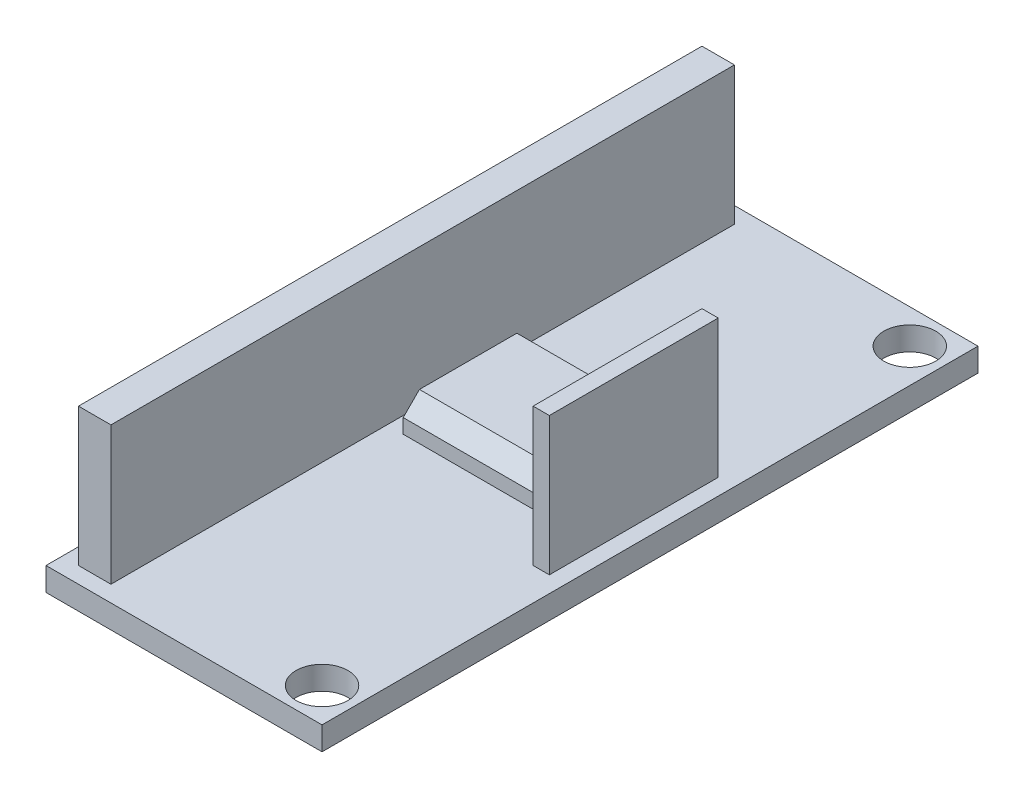
ISO-10303-21;
HEADER;
FILE_DESCRIPTION(('STEP AP214'),'2;1');
FILE_NAME('part.step','',(''),(''),'','','');
FILE_SCHEMA(('AUTOMOTIVE_DESIGN { 1 0 10303 214 1 1 1 1 }'));
ENDSEC;
DATA;
#1=APPLICATION_CONTEXT('core data for automotive mechanical design processes');
#2=APPLICATION_PROTOCOL_DEFINITION('international standard','automotive_design',2000,#1);
#3=PRODUCT_CONTEXT('',#1,'mechanical');
#4=PRODUCT('Part','Part','',(#3));
#5=PRODUCT_RELATED_PRODUCT_CATEGORY('part','',(#4));
#6=PRODUCT_DEFINITION_FORMATION('','',#4);
#7=PRODUCT_DEFINITION_CONTEXT('part definition',#1,'design');
#8=PRODUCT_DEFINITION('design','',#6,#7);
#9=PRODUCT_DEFINITION_SHAPE('','',#8);
#10=(LENGTH_UNIT() NAMED_UNIT(*) SI_UNIT(.MILLI.,.METRE.));
#11=(NAMED_UNIT(*) PLANE_ANGLE_UNIT() SI_UNIT($,.RADIAN.));
#12=(NAMED_UNIT(*) SI_UNIT($,.STERADIAN.) SOLID_ANGLE_UNIT());
#13=UNCERTAINTY_MEASURE_WITH_UNIT(LENGTH_MEASURE(1.E-05),#10,'distance_accuracy_value','');
#14=(GEOMETRIC_REPRESENTATION_CONTEXT(3) GLOBAL_UNCERTAINTY_ASSIGNED_CONTEXT((#13)) GLOBAL_UNIT_ASSIGNED_CONTEXT((#10,
#11,#12)) REPRESENTATION_CONTEXT('',''));
#15=CARTESIAN_POINT('',(0.,0.,0.));
#16=DIRECTION('',(0.,0.,1.));
#17=DIRECTION('',(1.,0.,0.));
#18=AXIS2_PLACEMENT_3D('',#15,#16,#17);
#19=CARTESIAN_POINT('',(0.,1.44,0.));
#20=DIRECTION('',(0.,-1.,0.));
#21=DIRECTION('',(0.,0.,-1.));
#22=AXIS2_PLACEMENT_3D('',#19,#20,#21);
#23=PLANE('',#22);
#24=DIRECTION('',(0.,0.,1.));
#25=VECTOR('',#24,1.);
#26=CARTESIAN_POINT('',(1.,1.44,-39.4));
#27=LINE('',#26,#25);
#28=CARTESIAN_POINT('',(1.,1.44,-39.4));
#29=VERTEX_POINT('',#28);
#30=CARTESIAN_POINT('',(1.,1.44,-1.));
#31=VERTEX_POINT('',#30);
#32=EDGE_CURVE('E181',#29,#31,#27,.T.);
#33=ORIENTED_EDGE('',*,*,#32,.F.);
#34=DIRECTION('',(-1.,0.,0.));
#35=VECTOR('',#34,1.);
#36=CARTESIAN_POINT('',(1.,1.44,-39.4));
#37=LINE('',#36,#35);
#38=CARTESIAN_POINT('',(3.,1.44,-39.4));
#39=VERTEX_POINT('',#38);
#40=EDGE_CURVE('E194',#39,#29,#37,.T.);
#41=ORIENTED_EDGE('',*,*,#40,.F.);
#42=DIRECTION('',(0.,0.,-1.));
#43=VECTOR('',#42,1.);
#44=CARTESIAN_POINT('',(3.,1.44,-39.4));
#45=LINE('',#44,#43);
#46=CARTESIAN_POINT('',(3.,1.44,-1.));
#47=VERTEX_POINT('',#46);
#48=EDGE_CURVE('E203',#47,#39,#45,.T.);
#49=ORIENTED_EDGE('',*,*,#48,.F.);
#50=DIRECTION('',(1.,0.,0.));
#51=VECTOR('',#50,1.);
#52=CARTESIAN_POINT('',(1.,1.44,-1.));
#53=LINE('',#52,#51);
#54=EDGE_CURVE('E184',#31,#47,#53,.T.);
#55=ORIENTED_EDGE('',*,*,#54,.F.);
#56=EDGE_LOOP('',(#33,#41,#49,#55));
#57=FACE_BOUND('',#56,.T.);
#58=DIRECTION('',(0.,0.,1.));
#59=VECTOR('',#58,1.);
#60=CARTESIAN_POINT('',(0.,1.44,0.));
#61=LINE('',#60,#59);
#62=CARTESIAN_POINT('',(0.,1.44,-40.4));
#63=VERTEX_POINT('',#62);
#64=CARTESIAN_POINT('',(0.,1.44,0.));
#65=VERTEX_POINT('',#64);
#66=EDGE_CURVE('E258',#63,#65,#61,.T.);
#67=ORIENTED_EDGE('',*,*,#66,.T.);
#68=DIRECTION('',(1.,0.,0.));
#69=VECTOR('',#68,1.);
#70=CARTESIAN_POINT('',(0.,1.44,0.));
#71=LINE('',#70,#69);
#72=CARTESIAN_POINT('',(17.,1.44,0.));
#73=VERTEX_POINT('',#72);
#74=EDGE_CURVE('E261',#65,#73,#71,.T.);
#75=ORIENTED_EDGE('',*,*,#74,.T.);
#76=DIRECTION('',(0.,0.,-1.));
#77=VECTOR('',#76,1.);
#78=CARTESIAN_POINT('',(17.,1.44,0.));
#79=LINE('',#78,#77);
#80=CARTESIAN_POINT('',(17.,1.44,-40.4));
#81=VERTEX_POINT('',#80);
#82=EDGE_CURVE('E264',#73,#81,#79,.T.);
#83=ORIENTED_EDGE('',*,*,#82,.T.);
#84=DIRECTION('',(-1.,0.,0.));
#85=VECTOR('',#84,1.);
#86=CARTESIAN_POINT('',(0.,1.44,-40.4));
#87=LINE('',#86,#85);
#88=EDGE_CURVE('E266',#81,#63,#87,.T.);
#89=ORIENTED_EDGE('',*,*,#88,.T.);
#90=EDGE_LOOP('',(#67,#75,#83,#89));
#91=FACE_BOUND('',#90,.T.);
#92=CARTESIAN_POINT('',(14.9,1.44,-2.1));
#93=DIRECTION('',(0.,1.,0.));
#94=DIRECTION('',(0.,0.,1.));
#95=AXIS2_PLACEMENT_3D('',#92,#93,#94);
#96=CIRCLE('',#95,1.6);
#97=CARTESIAN_POINT('',(14.9,1.44,-0.499999999999999));
#98=VERTEX_POINT('',#97);
#99=EDGE_CURVE('E245',#98,#98,#96,.T.);
#100=ORIENTED_EDGE('',*,*,#99,.F.);
#101=EDGE_LOOP('',(#100));
#102=FACE_BOUND('',#101,.T.);
#103=CARTESIAN_POINT('',(14.9,1.44,-38.3));
#104=DIRECTION('',(0.,1.,0.));
#105=DIRECTION('',(0.,0.,1.));
#106=AXIS2_PLACEMENT_3D('',#103,#104,#105);
#107=CIRCLE('',#106,1.6);
#108=CARTESIAN_POINT('',(14.9,1.44,-36.7));
#109=VERTEX_POINT('',#108);
#110=EDGE_CURVE('E250',#109,#109,#107,.T.);
#111=ORIENTED_EDGE('',*,*,#110,.F.);
#112=EDGE_LOOP('',(#111));
#113=FACE_BOUND('',#112,.T.);
#114=DIRECTION('',(0.,0.,1.));
#115=VECTOR('',#114,1.);
#116=CARTESIAN_POINT('',(4.,1.44,-26.));
#117=LINE('',#116,#115);
#118=CARTESIAN_POINT('',(4.,1.44,-26.));
#119=VERTEX_POINT('',#118);
#120=CARTESIAN_POINT('',(4.,1.44,-18.));
#121=VERTEX_POINT('',#120);
#122=EDGE_CURVE('E219',#119,#121,#117,.T.);
#123=ORIENTED_EDGE('',*,*,#122,.F.);
#124=DIRECTION('',(-1.,0.,0.));
#125=VECTOR('',#124,1.);
#126=CARTESIAN_POINT('',(4.,1.44,-26.));
#127=LINE('',#126,#125);
#128=CARTESIAN_POINT('',(14.,1.44,-26.));
#129=VERTEX_POINT('',#128);
#130=EDGE_CURVE('E224',#129,#119,#127,.T.);
#131=ORIENTED_EDGE('',*,*,#130,.F.);
#132=DIRECTION('',(0.,0.,-1.));
#133=VECTOR('',#132,1.);
#134=CARTESIAN_POINT('',(14.,1.44,-26.));
#135=LINE('',#134,#133);
#136=CARTESIAN_POINT('',(14.,1.44,-18.));
#137=VERTEX_POINT('',#136);
#138=EDGE_CURVE('E233',#137,#129,#135,.T.);
#139=ORIENTED_EDGE('',*,*,#138,.F.);
#140=DIRECTION('',(1.,0.,0.));
#141=VECTOR('',#140,1.);
#142=CARTESIAN_POINT('',(4.,1.44,-18.));
#143=LINE('',#142,#141);
#144=EDGE_CURVE('E230',#121,#137,#143,.T.);
#145=ORIENTED_EDGE('',*,*,#144,.F.);
#146=EDGE_LOOP('',(#123,#131,#139,#145));
#147=FACE_BOUND('',#146,.T.);
#148=DIRECTION('',(0.,0.,-1.));
#149=VECTOR('',#148,1.);
#150=CARTESIAN_POINT('',(16.,1.44,-25.4));
#151=LINE('',#150,#149);
#152=CARTESIAN_POINT('',(16.,1.44,-15.));
#153=VERTEX_POINT('',#152);
#154=CARTESIAN_POINT('',(16.,1.44,-25.4));
#155=VERTEX_POINT('',#154);
#156=EDGE_CURVE('E180',#153,#155,#151,.T.);
#157=ORIENTED_EDGE('',*,*,#156,.F.);
#158=DIRECTION('',(1.,0.,0.));
#159=VECTOR('',#158,1.);
#160=CARTESIAN_POINT('',(16.,1.44,-15.));
#161=LINE('',#160,#159);
#162=CARTESIAN_POINT('',(15.,1.44,-15.));
#163=VERTEX_POINT('',#162);
#164=EDGE_CURVE('E177',#163,#153,#161,.T.);
#165=ORIENTED_EDGE('',*,*,#164,.F.);
#166=DIRECTION('',(0.,0.,1.));
#167=VECTOR('',#166,1.);
#168=CARTESIAN_POINT('',(15.,1.44,-25.4));
#169=LINE('',#168,#167);
#170=CARTESIAN_POINT('',(15.,1.44,-25.4));
#171=VERTEX_POINT('',#170);
#172=EDGE_CURVE('E56',#171,#163,#169,.T.);
#173=ORIENTED_EDGE('',*,*,#172,.F.);
#174=DIRECTION('',(-1.,0.,0.));
#175=VECTOR('',#174,1.);
#176=CARTESIAN_POINT('',(16.,1.44,-25.4));
#177=LINE('',#176,#175);
#178=EDGE_CURVE('E51',#155,#171,#177,.T.);
#179=ORIENTED_EDGE('',*,*,#178,.F.);
#180=EDGE_LOOP('',(#157,#165,#173,#179));
#181=FACE_BOUND('',#180,.T.);
#182=ADVANCED_FACE('F35',(#57,#91,#102,#113,#147,#181),#23,.F.);
#183=CARTESIAN_POINT('',(0.,1.44,0.));
#184=DIRECTION('',(1.,0.,0.));
#185=DIRECTION('',(0.,0.,-1.));
#186=AXIS2_PLACEMENT_3D('',#183,#184,#185);
#187=PLANE('',#186);
#188=DIRECTION('',(0.,0.,1.));
#189=VECTOR('',#188,1.);
#190=CARTESIAN_POINT('',(0.,0.,0.));
#191=LINE('',#190,#189);
#192=CARTESIAN_POINT('',(0.,0.,-40.4));
#193=VERTEX_POINT('',#192);
#194=CARTESIAN_POINT('',(0.,0.,0.));
#195=VERTEX_POINT('',#194);
#196=EDGE_CURVE('E249',#193,#195,#191,.T.);
#197=ORIENTED_EDGE('',*,*,#196,.T.);
#198=DIRECTION('',(0.,-1.,0.));
#199=VECTOR('',#198,1.);
#200=CARTESIAN_POINT('',(0.,1.44,0.));
#201=LINE('',#200,#199);
#202=EDGE_CURVE('E284',#65,#195,#201,.T.);
#203=ORIENTED_EDGE('',*,*,#202,.F.);
#204=ORIENTED_EDGE('',*,*,#66,.F.);
#205=DIRECTION('',(0.,-1.,0.));
#206=VECTOR('',#205,1.);
#207=CARTESIAN_POINT('',(0.,1.44,-40.4));
#208=LINE('',#207,#206);
#209=EDGE_CURVE('E268',#63,#193,#208,.T.);
#210=ORIENTED_EDGE('',*,*,#209,.T.);
#211=EDGE_LOOP('',(#197,#203,#204,#210));
#212=FACE_BOUND('',#211,.T.);
#213=ADVANCED_FACE('F340',(#212),#187,.F.);
#214=CARTESIAN_POINT('',(0.,1.44,0.));
#215=DIRECTION('',(0.,0.,-1.));
#216=DIRECTION('',(-1.,0.,0.));
#217=AXIS2_PLACEMENT_3D('',#214,#215,#216);
#218=PLANE('',#217);
#219=DIRECTION('',(1.,0.,0.));
#220=VECTOR('',#219,1.);
#221=CARTESIAN_POINT('',(0.,0.,0.));
#222=LINE('',#221,#220);
#223=CARTESIAN_POINT('',(17.,0.,0.));
#224=VERTEX_POINT('',#223);
#225=EDGE_CURVE('E271',#195,#224,#222,.T.);
#226=ORIENTED_EDGE('',*,*,#225,.T.);
#227=DIRECTION('',(0.,-1.,0.));
#228=VECTOR('',#227,1.);
#229=CARTESIAN_POINT('',(17.,1.44,0.));
#230=LINE('',#229,#228);
#231=EDGE_CURVE('E281',#73,#224,#230,.T.);
#232=ORIENTED_EDGE('',*,*,#231,.F.);
#233=ORIENTED_EDGE('',*,*,#74,.F.);
#234=ORIENTED_EDGE('',*,*,#202,.T.);
#235=EDGE_LOOP('',(#226,#232,#233,#234));
#236=FACE_BOUND('',#235,.T.);
#237=ADVANCED_FACE('F346',(#236),#218,.F.);
#238=CARTESIAN_POINT('',(17.,1.44,0.));
#239=DIRECTION('',(-1.,0.,0.));
#240=DIRECTION('',(0.,0.,1.));
#241=AXIS2_PLACEMENT_3D('',#238,#239,#240);
#242=PLANE('',#241);
#243=DIRECTION('',(0.,0.,-1.));
#244=VECTOR('',#243,1.);
#245=CARTESIAN_POINT('',(17.,0.,0.));
#246=LINE('',#245,#244);
#247=CARTESIAN_POINT('',(17.,0.,-40.4));
#248=VERTEX_POINT('',#247);
#249=EDGE_CURVE('E273',#224,#248,#246,.T.);
#250=ORIENTED_EDGE('',*,*,#249,.T.);
#251=DIRECTION('',(0.,-1.,0.));
#252=VECTOR('',#251,1.);
#253=CARTESIAN_POINT('',(17.,1.44,-40.4));
#254=LINE('',#253,#252);
#255=EDGE_CURVE('E278',#81,#248,#254,.T.);
#256=ORIENTED_EDGE('',*,*,#255,.F.);
#257=ORIENTED_EDGE('',*,*,#82,.F.);
#258=ORIENTED_EDGE('',*,*,#231,.T.);
#259=EDGE_LOOP('',(#250,#256,#257,#258));
#260=FACE_BOUND('',#259,.T.);
#261=ADVANCED_FACE('F361',(#260),#242,.F.);
#262=CARTESIAN_POINT('',(0.,1.44,-40.4));
#263=DIRECTION('',(0.,0.,1.));
#264=DIRECTION('',(1.,0.,0.));
#265=AXIS2_PLACEMENT_3D('',#262,#263,#264);
#266=PLANE('',#265);
#267=DIRECTION('',(-1.,0.,0.));
#268=VECTOR('',#267,1.);
#269=CARTESIAN_POINT('',(0.,0.,-40.4));
#270=LINE('',#269,#268);
#271=EDGE_CURVE('E262',#248,#193,#270,.T.);
#272=ORIENTED_EDGE('',*,*,#271,.T.);
#273=ORIENTED_EDGE('',*,*,#209,.F.);
#274=ORIENTED_EDGE('',*,*,#88,.F.);
#275=ORIENTED_EDGE('',*,*,#255,.T.);
#276=EDGE_LOOP('',(#272,#273,#274,#275));
#277=FACE_BOUND('',#276,.T.);
#278=ADVANCED_FACE('F357',(#277),#266,.F.);
#279=CARTESIAN_POINT('',(0.,0.,0.));
#280=DIRECTION('',(0.,-1.,0.));
#281=DIRECTION('',(0.,0.,-1.));
#282=AXIS2_PLACEMENT_3D('',#279,#280,#281);
#283=PLANE('',#282);
#284=CARTESIAN_POINT('',(14.9,0.,-38.3));
#285=DIRECTION('',(0.,1.,0.));
#286=DIRECTION('',(0.,0.,1.));
#287=AXIS2_PLACEMENT_3D('',#284,#285,#286);
#288=CIRCLE('',#287,1.6);
#289=CARTESIAN_POINT('',(14.9,0.,-36.7));
#290=VERTEX_POINT('',#289);
#291=EDGE_CURVE('E246',#290,#290,#288,.T.);
#292=ORIENTED_EDGE('',*,*,#291,.T.);
#293=EDGE_LOOP('',(#292));
#294=FACE_BOUND('',#293,.T.);
#295=CARTESIAN_POINT('',(14.9,0.,-2.1));
#296=DIRECTION('',(0.,1.,0.));
#297=DIRECTION('',(0.,0.,1.));
#298=AXIS2_PLACEMENT_3D('',#295,#296,#297);
#299=CIRCLE('',#298,1.6);
#300=CARTESIAN_POINT('',(14.9,0.,-0.499999999999999));
#301=VERTEX_POINT('',#300);
#302=EDGE_CURVE('E253',#301,#301,#299,.T.);
#303=ORIENTED_EDGE('',*,*,#302,.T.);
#304=EDGE_LOOP('',(#303));
#305=FACE_BOUND('',#304,.T.);
#306=ORIENTED_EDGE('',*,*,#196,.F.);
#307=ORIENTED_EDGE('',*,*,#271,.F.);
#308=ORIENTED_EDGE('',*,*,#249,.F.);
#309=ORIENTED_EDGE('',*,*,#225,.F.);
#310=EDGE_LOOP('',(#306,#307,#308,#309));
#311=FACE_BOUND('',#310,.T.);
#312=ADVANCED_FACE('F354',(#294,#305,#311),#283,.T.);
#313=CARTESIAN_POINT('',(14.9,0.,-2.1));
#314=DIRECTION('',(0.,1.,0.));
#315=DIRECTION('',(0.,0.,1.));
#316=AXIS2_PLACEMENT_3D('',#313,#314,#315);
#317=CYLINDRICAL_SURFACE('',#316,1.6);
#318=CARTESIAN_POINT('',(14.9,0.,-0.499999999999999));
#319=CARTESIAN_POINT('',(14.9,0.015,-0.499999999999999));
#320=CARTESIAN_POINT('',(14.9,0.03,-0.499999999999999));
#321=CARTESIAN_POINT('',(14.9,0.06,-0.499999999999999));
#322=CARTESIAN_POINT('',(14.9,0.075,-0.499999999999999));
#323=CARTESIAN_POINT('',(14.9,0.105,-0.499999999999999));
#324=CARTESIAN_POINT('',(14.9,0.12,-0.499999999999999));
#325=CARTESIAN_POINT('',(14.9,0.15,-0.499999999999999));
#326=CARTESIAN_POINT('',(14.9,0.165,-0.499999999999999));
#327=CARTESIAN_POINT('',(14.9,0.195,-0.499999999999999));
#328=CARTESIAN_POINT('',(14.9,0.21,-0.499999999999999));
#329=CARTESIAN_POINT('',(14.9,0.24,-0.499999999999999));
#330=CARTESIAN_POINT('',(14.9,0.255,-0.499999999999999));
#331=CARTESIAN_POINT('',(14.9,0.285,-0.499999999999999));
#332=CARTESIAN_POINT('',(14.9,0.3,-0.499999999999999));
#333=CARTESIAN_POINT('',(14.9,0.33,-0.499999999999999));
#334=CARTESIAN_POINT('',(14.9,0.345,-0.499999999999999));
#335=CARTESIAN_POINT('',(14.9,0.375,-0.499999999999999));
#336=CARTESIAN_POINT('',(14.9,0.39,-0.499999999999999));
#337=CARTESIAN_POINT('',(14.9,0.42,-0.499999999999999));
#338=CARTESIAN_POINT('',(14.9,0.435,-0.499999999999999));
#339=CARTESIAN_POINT('',(14.9,0.465,-0.499999999999999));
#340=CARTESIAN_POINT('',(14.9,0.48,-0.499999999999999));
#341=CARTESIAN_POINT('',(14.9,0.51,-0.499999999999999));
#342=CARTESIAN_POINT('',(14.9,0.525,-0.499999999999999));
#343=CARTESIAN_POINT('',(14.9,0.555,-0.499999999999999));
#344=CARTESIAN_POINT('',(14.9,0.57,-0.499999999999999));
#345=CARTESIAN_POINT('',(14.9,0.6,-0.499999999999999));
#346=CARTESIAN_POINT('',(14.9,0.615,-0.499999999999999));
#347=CARTESIAN_POINT('',(14.9,0.645,-0.499999999999999));
#348=CARTESIAN_POINT('',(14.9,0.66,-0.499999999999999));
#349=CARTESIAN_POINT('',(14.9,0.69,-0.499999999999999));
#350=CARTESIAN_POINT('',(14.9,0.705,-0.499999999999999));
#351=CARTESIAN_POINT('',(14.9,0.735,-0.499999999999999));
#352=CARTESIAN_POINT('',(14.9,0.75,-0.499999999999999));
#353=CARTESIAN_POINT('',(14.9,0.78,-0.499999999999999));
#354=CARTESIAN_POINT('',(14.9,0.795,-0.499999999999999));
#355=CARTESIAN_POINT('',(14.9,0.825,-0.499999999999999));
#356=CARTESIAN_POINT('',(14.9,0.84,-0.499999999999999));
#357=CARTESIAN_POINT('',(14.9,0.87,-0.499999999999999));
#358=CARTESIAN_POINT('',(14.9,0.885,-0.499999999999999));
#359=CARTESIAN_POINT('',(14.9,0.915,-0.499999999999999));
#360=CARTESIAN_POINT('',(14.9,0.93,-0.499999999999999));
#361=CARTESIAN_POINT('',(14.9,0.96,-0.499999999999999));
#362=CARTESIAN_POINT('',(14.9,0.975,-0.499999999999999));
#363=CARTESIAN_POINT('',(14.9,1.005,-0.499999999999999));
#364=CARTESIAN_POINT('',(14.9,1.02,-0.499999999999999));
#365=CARTESIAN_POINT('',(14.9,1.05,-0.499999999999999));
#366=CARTESIAN_POINT('',(14.9,1.065,-0.499999999999999));
#367=CARTESIAN_POINT('',(14.9,1.095,-0.499999999999999));
#368=CARTESIAN_POINT('',(14.9,1.11,-0.499999999999999));
#369=CARTESIAN_POINT('',(14.9,1.14,-0.499999999999999));
#370=CARTESIAN_POINT('',(14.9,1.155,-0.499999999999999));
#371=CARTESIAN_POINT('',(14.9,1.185,-0.499999999999999));
#372=CARTESIAN_POINT('',(14.9,1.2,-0.499999999999999));
#373=CARTESIAN_POINT('',(14.9,1.23,-0.499999999999999));
#374=CARTESIAN_POINT('',(14.9,1.245,-0.499999999999999));
#375=CARTESIAN_POINT('',(14.9,1.275,-0.499999999999999));
#376=CARTESIAN_POINT('',(14.9,1.29,-0.499999999999999));
#377=CARTESIAN_POINT('',(14.9,1.32,-0.499999999999999));
#378=CARTESIAN_POINT('',(14.9,1.335,-0.499999999999999));
#379=CARTESIAN_POINT('',(14.9,1.365,-0.499999999999999));
#380=CARTESIAN_POINT('',(14.9,1.38,-0.499999999999999));
#381=CARTESIAN_POINT('',(14.9,1.41,-0.499999999999999));
#382=CARTESIAN_POINT('',(14.9,1.425,-0.499999999999999));
#383=CARTESIAN_POINT('',(14.9,1.44,-0.499999999999999));
#384=B_SPLINE_CURVE_WITH_KNOTS('',3,(#318,#319,#320,#321,#322,#323,#324,#325,#326,#327,#328,
#329,#330,#331,#332,#333,#334,#335,#336,#337,#338,#339,#340,#341,#342,#343,#344,#345,#346,#347,
#348,#349,#350,#351,#352,#353,#354,#355,#356,#357,#358,#359,#360,#361,#362,#363,#364,#365,#366,
#367,#368,#369,#370,#371,#372,#373,#374,#375,#376,#377,#378,#379,#380,#381,#382,#383),
.UNSPECIFIED.,.F.,.F.,(4,2,2,2,2,2,2,2,2,2,2,2,2,2,2,2,2,2,2,2,2,2,2,2,2,2,2,2,2,2,2,2,4),(0.,
0.045,0.09,0.135,0.18,0.225,0.27,0.315,0.36,0.405,0.45,0.495,0.54,0.585,0.63,0.675,0.72,0.765,
0.81,0.855,0.9,0.945,0.99,1.035,1.08,1.125,1.17,1.215,1.26,1.305,1.35,1.395,1.44),.UNSPECIFIED.);
#385=EDGE_CURVE('BSEAM352',#301,#98,#384,.T.);
#386=ORIENTED_EDGE('',*,*,#302,.F.);
#387=ORIENTED_EDGE('',*,*,#99,.T.);
#388=ORIENTED_EDGE('',*,*,#385,.T.);
#389=ORIENTED_EDGE('',*,*,#385,.F.);
#390=EDGE_LOOP('',(#386,#388,#387,#389));
#391=FACE_BOUND('',#390,.T.);
#392=ADVANCED_FACE('F352',(#391),#317,.F.);
#393=CARTESIAN_POINT('',(14.9,0.,-38.3));
#394=DIRECTION('',(0.,1.,0.));
#395=DIRECTION('',(0.,0.,1.));
#396=AXIS2_PLACEMENT_3D('',#393,#394,#395);
#397=CYLINDRICAL_SURFACE('',#396,1.6);
#398=CARTESIAN_POINT('',(14.9,0.,-36.7));
#399=CARTESIAN_POINT('',(14.9,0.015,-36.7));
#400=CARTESIAN_POINT('',(14.9,0.03,-36.7));
#401=CARTESIAN_POINT('',(14.9,0.06,-36.7));
#402=CARTESIAN_POINT('',(14.9,0.075,-36.7));
#403=CARTESIAN_POINT('',(14.9,0.105,-36.7));
#404=CARTESIAN_POINT('',(14.9,0.12,-36.7));
#405=CARTESIAN_POINT('',(14.9,0.15,-36.7));
#406=CARTESIAN_POINT('',(14.9,0.165,-36.7));
#407=CARTESIAN_POINT('',(14.9,0.195,-36.7));
#408=CARTESIAN_POINT('',(14.9,0.21,-36.7));
#409=CARTESIAN_POINT('',(14.9,0.24,-36.7));
#410=CARTESIAN_POINT('',(14.9,0.255,-36.7));
#411=CARTESIAN_POINT('',(14.9,0.285,-36.7));
#412=CARTESIAN_POINT('',(14.9,0.3,-36.7));
#413=CARTESIAN_POINT('',(14.9,0.33,-36.7));
#414=CARTESIAN_POINT('',(14.9,0.345,-36.7));
#415=CARTESIAN_POINT('',(14.9,0.375,-36.7));
#416=CARTESIAN_POINT('',(14.9,0.39,-36.7));
#417=CARTESIAN_POINT('',(14.9,0.42,-36.7));
#418=CARTESIAN_POINT('',(14.9,0.435,-36.7));
#419=CARTESIAN_POINT('',(14.9,0.465,-36.7));
#420=CARTESIAN_POINT('',(14.9,0.48,-36.7));
#421=CARTESIAN_POINT('',(14.9,0.51,-36.7));
#422=CARTESIAN_POINT('',(14.9,0.525,-36.7));
#423=CARTESIAN_POINT('',(14.9,0.555,-36.7));
#424=CARTESIAN_POINT('',(14.9,0.57,-36.7));
#425=CARTESIAN_POINT('',(14.9,0.6,-36.7));
#426=CARTESIAN_POINT('',(14.9,0.615,-36.7));
#427=CARTESIAN_POINT('',(14.9,0.645,-36.7));
#428=CARTESIAN_POINT('',(14.9,0.66,-36.7));
#429=CARTESIAN_POINT('',(14.9,0.69,-36.7));
#430=CARTESIAN_POINT('',(14.9,0.705,-36.7));
#431=CARTESIAN_POINT('',(14.9,0.735,-36.7));
#432=CARTESIAN_POINT('',(14.9,0.75,-36.7));
#433=CARTESIAN_POINT('',(14.9,0.78,-36.7));
#434=CARTESIAN_POINT('',(14.9,0.795,-36.7));
#435=CARTESIAN_POINT('',(14.9,0.825,-36.7));
#436=CARTESIAN_POINT('',(14.9,0.84,-36.7));
#437=CARTESIAN_POINT('',(14.9,0.87,-36.7));
#438=CARTESIAN_POINT('',(14.9,0.885,-36.7));
#439=CARTESIAN_POINT('',(14.9,0.915,-36.7));
#440=CARTESIAN_POINT('',(14.9,0.93,-36.7));
#441=CARTESIAN_POINT('',(14.9,0.96,-36.7));
#442=CARTESIAN_POINT('',(14.9,0.975,-36.7));
#443=CARTESIAN_POINT('',(14.9,1.005,-36.7));
#444=CARTESIAN_POINT('',(14.9,1.02,-36.7));
#445=CARTESIAN_POINT('',(14.9,1.05,-36.7));
#446=CARTESIAN_POINT('',(14.9,1.065,-36.7));
#447=CARTESIAN_POINT('',(14.9,1.095,-36.7));
#448=CARTESIAN_POINT('',(14.9,1.11,-36.7));
#449=CARTESIAN_POINT('',(14.9,1.14,-36.7));
#450=CARTESIAN_POINT('',(14.9,1.155,-36.7));
#451=CARTESIAN_POINT('',(14.9,1.185,-36.7));
#452=CARTESIAN_POINT('',(14.9,1.2,-36.7));
#453=CARTESIAN_POINT('',(14.9,1.23,-36.7));
#454=CARTESIAN_POINT('',(14.9,1.245,-36.7));
#455=CARTESIAN_POINT('',(14.9,1.275,-36.7));
#456=CARTESIAN_POINT('',(14.9,1.29,-36.7));
#457=CARTESIAN_POINT('',(14.9,1.32,-36.7));
#458=CARTESIAN_POINT('',(14.9,1.335,-36.7));
#459=CARTESIAN_POINT('',(14.9,1.365,-36.7));
#460=CARTESIAN_POINT('',(14.9,1.38,-36.7));
#461=CARTESIAN_POINT('',(14.9,1.41,-36.7));
#462=CARTESIAN_POINT('',(14.9,1.425,-36.7));
#463=CARTESIAN_POINT('',(14.9,1.44,-36.7));
#464=B_SPLINE_CURVE_WITH_KNOTS('',3,(#398,#399,#400,#401,#402,#403,#404,#405,#406,#407,#408,
#409,#410,#411,#412,#413,#414,#415,#416,#417,#418,#419,#420,#421,#422,#423,#424,#425,#426,#427,
#428,#429,#430,#431,#432,#433,#434,#435,#436,#437,#438,#439,#440,#441,#442,#443,#444,#445,#446,
#447,#448,#449,#450,#451,#452,#453,#454,#455,#456,#457,#458,#459,#460,#461,#462,#463),
.UNSPECIFIED.,.F.,.F.,(4,2,2,2,2,2,2,2,2,2,2,2,2,2,2,2,2,2,2,2,2,2,2,2,2,2,2,2,2,2,2,2,4),(0.,
0.045,0.09,0.135,0.18,0.225,0.27,0.315,0.36,0.405,0.45,0.495,0.54,0.585,0.63,0.675,0.72,0.765,
0.81,0.855,0.9,0.945,0.99,1.035,1.08,1.125,1.17,1.215,1.26,1.305,1.35,1.395,1.44),.UNSPECIFIED.);
#465=EDGE_CURVE('BSEAM391',#290,#109,#464,.T.);
#466=ORIENTED_EDGE('',*,*,#291,.F.);
#467=ORIENTED_EDGE('',*,*,#110,.T.);
#468=ORIENTED_EDGE('',*,*,#465,.T.);
#469=ORIENTED_EDGE('',*,*,#465,.F.);
#470=EDGE_LOOP('',(#466,#468,#467,#469));
#471=FACE_BOUND('',#470,.T.);
#472=ADVANCED_FACE('F391',(#471),#397,.F.);
#473=CARTESIAN_POINT('',(4.,3.33,-26.));
#474=DIRECTION('',(1.,0.,0.));
#475=DIRECTION('',(0.,0.,-1.));
#476=AXIS2_PLACEMENT_3D('',#473,#474,#475);
#477=PLANE('',#476);
#478=DIRECTION('',(0.,0.,1.));
#479=VECTOR('',#478,1.);
#480=CARTESIAN_POINT('',(4.,3.33,-26.));
#481=LINE('',#480,#479);
#482=CARTESIAN_POINT('',(4.,3.33,-25.));
#483=VERTEX_POINT('',#482);
#484=CARTESIAN_POINT('',(4.,3.33,-19.));
#485=VERTEX_POINT('',#484);
#486=EDGE_CURVE('E220',#483,#485,#481,.T.);
#487=ORIENTED_EDGE('',*,*,#486,.F.);
#488=DIRECTION('',(0.,-0.707106781186549,-0.707106781186546));
#489=VECTOR('',#488,1.);
#490=CARTESIAN_POINT('',(4.,3.33,-25.));
#491=LINE('',#490,#489);
#492=CARTESIAN_POINT('',(4.,2.33,-26.));
#493=VERTEX_POINT('',#492);
#494=EDGE_CURVE('E295',#483,#493,#491,.T.);
#495=ORIENTED_EDGE('',*,*,#494,.T.);
#496=DIRECTION('',(0.,-1.,0.));
#497=VECTOR('',#496,1.);
#498=CARTESIAN_POINT('',(4.,3.33,-26.));
#499=LINE('',#498,#497);
#500=EDGE_CURVE('E227',#493,#119,#499,.T.);
#501=ORIENTED_EDGE('',*,*,#500,.T.);
#502=ORIENTED_EDGE('',*,*,#122,.T.);
#503=DIRECTION('',(0.,-1.,0.));
#504=VECTOR('',#503,1.);
#505=CARTESIAN_POINT('',(4.,3.33,-18.));
#506=LINE('',#505,#504);
#507=CARTESIAN_POINT('',(4.,2.33,-18.));
#508=VERTEX_POINT('',#507);
#509=EDGE_CURVE('E243',#508,#121,#506,.T.);
#510=ORIENTED_EDGE('',*,*,#509,.F.);
#511=DIRECTION('',(0.,0.707106781186547,-0.707106781186548));
#512=VECTOR('',#511,1.);
#513=CARTESIAN_POINT('',(4.,3.33,-19.));
#514=LINE('',#513,#512);
#515=EDGE_CURVE('E293',#508,#485,#514,.T.);
#516=ORIENTED_EDGE('',*,*,#515,.T.);
#517=EDGE_LOOP('',(#487,#495,#501,#502,#510,#516));
#518=FACE_BOUND('',#517,.T.);
#519=ADVANCED_FACE('F315',(#518),#477,.F.);
#520=CARTESIAN_POINT('',(4.,3.33,-18.));
#521=DIRECTION('',(0.,0.,-1.));
#522=DIRECTION('',(-1.,0.,0.));
#523=AXIS2_PLACEMENT_3D('',#520,#521,#522);
#524=PLANE('',#523);
#525=DIRECTION('',(0.,-1.,0.));
#526=VECTOR('',#525,1.);
#527=CARTESIAN_POINT('',(14.,3.33,-18.));
#528=LINE('',#527,#526);
#529=CARTESIAN_POINT('',(14.,2.33,-18.));
#530=VERTEX_POINT('',#529);
#531=EDGE_CURVE('E241',#530,#137,#528,.T.);
#532=ORIENTED_EDGE('',*,*,#531,.F.);
#533=DIRECTION('',(-1.,0.,0.));
#534=VECTOR('',#533,1.);
#535=CARTESIAN_POINT('',(4.,2.33,-18.));
#536=LINE('',#535,#534);
#537=EDGE_CURVE('E11',#530,#508,#536,.T.);
#538=ORIENTED_EDGE('',*,*,#537,.T.);
#539=ORIENTED_EDGE('',*,*,#509,.T.);
#540=ORIENTED_EDGE('',*,*,#144,.T.);
#541=EDGE_LOOP('',(#532,#538,#539,#540));
#542=FACE_BOUND('',#541,.T.);
#543=ADVANCED_FACE('F326',(#542),#524,.F.);
#544=CARTESIAN_POINT('',(14.,3.33,-26.));
#545=DIRECTION('',(-1.,0.,0.));
#546=DIRECTION('',(0.,0.,1.));
#547=AXIS2_PLACEMENT_3D('',#544,#545,#546);
#548=PLANE('',#547);
#549=DIRECTION('',(0.,-1.,0.));
#550=VECTOR('',#549,1.);
#551=CARTESIAN_POINT('',(14.,3.33,-26.));
#552=LINE('',#551,#550);
#553=CARTESIAN_POINT('',(14.,2.33,-26.));
#554=VERTEX_POINT('',#553);
#555=EDGE_CURVE('E239',#554,#129,#552,.T.);
#556=ORIENTED_EDGE('',*,*,#555,.F.);
#557=DIRECTION('',(0.,0.707106781186549,0.707106781186546));
#558=VECTOR('',#557,1.);
#559=CARTESIAN_POINT('',(14.,3.33,-25.));
#560=LINE('',#559,#558);
#561=CARTESIAN_POINT('',(14.,3.33,-25.));
#562=VERTEX_POINT('',#561);
#563=EDGE_CURVE('E44',#554,#562,#560,.T.);
#564=ORIENTED_EDGE('',*,*,#563,.T.);
#565=DIRECTION('',(0.,0.,-1.));
#566=VECTOR('',#565,1.);
#567=CARTESIAN_POINT('',(14.,3.33,-26.));
#568=LINE('',#567,#566);
#569=CARTESIAN_POINT('',(14.,3.33,-19.));
#570=VERTEX_POINT('',#569);
#571=EDGE_CURVE('E223',#570,#562,#568,.T.);
#572=ORIENTED_EDGE('',*,*,#571,.F.);
#573=DIRECTION('',(0.,-0.707106781186547,0.707106781186548));
#574=VECTOR('',#573,1.);
#575=CARTESIAN_POINT('',(14.,3.33,-19.));
#576=LINE('',#575,#574);
#577=EDGE_CURVE('E299',#570,#530,#576,.T.);
#578=ORIENTED_EDGE('',*,*,#577,.T.);
#579=ORIENTED_EDGE('',*,*,#531,.T.);
#580=ORIENTED_EDGE('',*,*,#138,.T.);
#581=EDGE_LOOP('',(#556,#564,#572,#578,#579,#580));
#582=FACE_BOUND('',#581,.T.);
#583=ADVANCED_FACE('F304',(#582),#548,.F.);
#584=CARTESIAN_POINT('',(4.,3.33,-26.));
#585=DIRECTION('',(0.,0.,1.));
#586=DIRECTION('',(1.,0.,0.));
#587=AXIS2_PLACEMENT_3D('',#584,#585,#586);
#588=PLANE('',#587);
#589=ORIENTED_EDGE('',*,*,#500,.F.);
#590=DIRECTION('',(1.,0.,0.));
#591=VECTOR('',#590,1.);
#592=CARTESIAN_POINT('',(14.,2.33,-26.));
#593=LINE('',#592,#591);
#594=EDGE_CURVE('E297',#493,#554,#593,.T.);
#595=ORIENTED_EDGE('',*,*,#594,.T.);
#596=ORIENTED_EDGE('',*,*,#555,.T.);
#597=ORIENTED_EDGE('',*,*,#130,.T.);
#598=EDGE_LOOP('',(#589,#595,#596,#597));
#599=FACE_BOUND('',#598,.T.);
#600=ADVANCED_FACE('F318',(#599),#588,.F.);
#601=CARTESIAN_POINT('',(0.,3.33,0.));
#602=DIRECTION('',(0.,1.,0.));
#603=DIRECTION('',(0.,0.,1.));
#604=AXIS2_PLACEMENT_3D('',#601,#602,#603);
#605=PLANE('',#604);
#606=ORIENTED_EDGE('',*,*,#571,.T.);
#607=DIRECTION('',(-1.,0.,0.));
#608=VECTOR('',#607,1.);
#609=CARTESIAN_POINT('',(4.,3.33,-25.));
#610=LINE('',#609,#608);
#611=EDGE_CURVE('E290',#562,#483,#610,.T.);
#612=ORIENTED_EDGE('',*,*,#611,.T.);
#613=ORIENTED_EDGE('',*,*,#486,.T.);
#614=DIRECTION('',(1.,0.,0.));
#615=VECTOR('',#614,1.);
#616=CARTESIAN_POINT('',(14.,3.33,-19.));
#617=LINE('',#616,#615);
#618=EDGE_CURVE('E287',#485,#570,#617,.T.);
#619=ORIENTED_EDGE('',*,*,#618,.T.);
#620=EDGE_LOOP('',(#606,#612,#613,#619));
#621=FACE_BOUND('',#620,.T.);
#622=ADVANCED_FACE('F309',(#621),#605,.T.);
#623=CARTESIAN_POINT('',(0.,3.33,-25.));
#624=DIRECTION('',(0.,0.707106781186546,-0.707106781186549));
#625=DIRECTION('',(1.,0.,0.));
#626=AXIS2_PLACEMENT_3D('',#623,#624,#625);
#627=PLANE('',#626);
#628=ORIENTED_EDGE('',*,*,#563,.F.);
#629=ORIENTED_EDGE('',*,*,#594,.F.);
#630=ORIENTED_EDGE('',*,*,#494,.F.);
#631=ORIENTED_EDGE('',*,*,#611,.F.);
#632=EDGE_LOOP('',(#628,#629,#630,#631));
#633=FACE_BOUND('',#632,.T.);
#634=ADVANCED_FACE('F312',(#633),#627,.T.);
#635=CARTESIAN_POINT('',(0.,3.33,-19.));
#636=DIRECTION('',(0.,0.707106781186548,0.707106781186547));
#637=DIRECTION('',(-1.,0.,0.));
#638=AXIS2_PLACEMENT_3D('',#635,#636,#637);
#639=PLANE('',#638);
#640=ORIENTED_EDGE('',*,*,#515,.F.);
#641=ORIENTED_EDGE('',*,*,#537,.F.);
#642=ORIENTED_EDGE('',*,*,#577,.F.);
#643=ORIENTED_EDGE('',*,*,#618,.F.);
#644=EDGE_LOOP('',(#640,#641,#642,#643));
#645=FACE_BOUND('',#644,.T.);
#646=ADVANCED_FACE('F38',(#645),#639,.T.);
#647=CARTESIAN_POINT('',(1.,9.94,-39.4));
#648=DIRECTION('',(1.,0.,0.));
#649=DIRECTION('',(0.,0.,-1.));
#650=AXIS2_PLACEMENT_3D('',#647,#648,#649);
#651=PLANE('',#650);
#652=ORIENTED_EDGE('',*,*,#32,.T.);
#653=DIRECTION('',(0.,-1.,0.));
#654=VECTOR('',#653,1.);
#655=CARTESIAN_POINT('',(1.,9.94,-1.));
#656=LINE('',#655,#654);
#657=CARTESIAN_POINT('',(1.,9.94,-1.));
#658=VERTEX_POINT('',#657);
#659=EDGE_CURVE('E216',#658,#31,#656,.T.);
#660=ORIENTED_EDGE('',*,*,#659,.F.);
#661=DIRECTION('',(0.,0.,1.));
#662=VECTOR('',#661,1.);
#663=CARTESIAN_POINT('',(1.,9.94,-39.4));
#664=LINE('',#663,#662);
#665=CARTESIAN_POINT('',(1.,9.94,-39.4));
#666=VERTEX_POINT('',#665);
#667=EDGE_CURVE('E190',#666,#658,#664,.T.);
#668=ORIENTED_EDGE('',*,*,#667,.F.);
#669=DIRECTION('',(0.,-1.,0.));
#670=VECTOR('',#669,1.);
#671=CARTESIAN_POINT('',(1.,9.94,-39.4));
#672=LINE('',#671,#670);
#673=EDGE_CURVE('E199',#666,#29,#672,.T.);
#674=ORIENTED_EDGE('',*,*,#673,.T.);
#675=EDGE_LOOP('',(#652,#660,#668,#674));
#676=FACE_BOUND('',#675,.T.);
#677=ADVANCED_FACE('F331',(#676),#651,.F.);
#678=CARTESIAN_POINT('',(1.,9.94,-1.));
#679=DIRECTION('',(0.,0.,-1.));
#680=DIRECTION('',(-1.,0.,0.));
#681=AXIS2_PLACEMENT_3D('',#678,#679,#680);
#682=PLANE('',#681);
#683=ORIENTED_EDGE('',*,*,#54,.T.);
#684=DIRECTION('',(0.,-1.,0.));
#685=VECTOR('',#684,1.);
#686=CARTESIAN_POINT('',(3.,9.94,-1.));
#687=LINE('',#686,#685);
#688=CARTESIAN_POINT('',(3.,9.94,-1.));
#689=VERTEX_POINT('',#688);
#690=EDGE_CURVE('E213',#689,#47,#687,.T.);
#691=ORIENTED_EDGE('',*,*,#690,.F.);
#692=DIRECTION('',(1.,0.,0.));
#693=VECTOR('',#692,1.);
#694=CARTESIAN_POINT('',(1.,9.94,-1.));
#695=LINE('',#694,#693);
#696=EDGE_CURVE('E193',#658,#689,#695,.T.);
#697=ORIENTED_EDGE('',*,*,#696,.F.);
#698=ORIENTED_EDGE('',*,*,#659,.T.);
#699=EDGE_LOOP('',(#683,#691,#697,#698));
#700=FACE_BOUND('',#699,.T.);
#701=ADVANCED_FACE('F336',(#700),#682,.F.);
#702=CARTESIAN_POINT('',(3.,9.94,-39.4));
#703=DIRECTION('',(-1.,0.,0.));
#704=DIRECTION('',(0.,0.,1.));
#705=AXIS2_PLACEMENT_3D('',#702,#703,#704);
#706=PLANE('',#705);
#707=ORIENTED_EDGE('',*,*,#48,.T.);
#708=DIRECTION('',(0.,-1.,0.));
#709=VECTOR('',#708,1.);
#710=CARTESIAN_POINT('',(3.,9.94,-39.4));
#711=LINE('',#710,#709);
#712=CARTESIAN_POINT('',(3.,9.94,-39.4));
#713=VERTEX_POINT('',#712);
#714=EDGE_CURVE('E210',#713,#39,#711,.T.);
#715=ORIENTED_EDGE('',*,*,#714,.F.);
#716=DIRECTION('',(0.,0.,-1.));
#717=VECTOR('',#716,1.);
#718=CARTESIAN_POINT('',(3.,9.94,-39.4));
#719=LINE('',#718,#717);
#720=EDGE_CURVE('E196',#689,#713,#719,.T.);
#721=ORIENTED_EDGE('',*,*,#720,.F.);
#722=ORIENTED_EDGE('',*,*,#690,.T.);
#723=EDGE_LOOP('',(#707,#715,#721,#722));
#724=FACE_BOUND('',#723,.T.);
#725=ADVANCED_FACE('F412',(#724),#706,.F.);
#726=CARTESIAN_POINT('',(1.,9.94,-39.4));
#727=DIRECTION('',(0.,0.,1.));
#728=DIRECTION('',(1.,0.,0.));
#729=AXIS2_PLACEMENT_3D('',#726,#727,#728);
#730=PLANE('',#729);
#731=ORIENTED_EDGE('',*,*,#40,.T.);
#732=ORIENTED_EDGE('',*,*,#673,.F.);
#733=DIRECTION('',(-1.,0.,0.));
#734=VECTOR('',#733,1.);
#735=CARTESIAN_POINT('',(1.,9.94,-39.4));
#736=LINE('',#735,#734);
#737=EDGE_CURVE('E198',#713,#666,#736,.T.);
#738=ORIENTED_EDGE('',*,*,#737,.F.);
#739=ORIENTED_EDGE('',*,*,#714,.T.);
#740=EDGE_LOOP('',(#731,#732,#738,#739));
#741=FACE_BOUND('',#740,.T.);
#742=ADVANCED_FACE('F416',(#741),#730,.F.);
#743=CARTESIAN_POINT('',(0.,9.94,0.));
#744=DIRECTION('',(0.,1.,0.));
#745=DIRECTION('',(0.,0.,1.));
#746=AXIS2_PLACEMENT_3D('',#743,#744,#745);
#747=PLANE('',#746);
#748=ORIENTED_EDGE('',*,*,#667,.T.);
#749=ORIENTED_EDGE('',*,*,#696,.T.);
#750=ORIENTED_EDGE('',*,*,#720,.T.);
#751=ORIENTED_EDGE('',*,*,#737,.T.);
#752=EDGE_LOOP('',(#748,#749,#750,#751));
#753=FACE_BOUND('',#752,.T.);
#754=ADVANCED_FACE('F420',(#753),#747,.T.);
#755=CARTESIAN_POINT('',(16.,9.94,-25.4));
#756=DIRECTION('',(-1.,0.,0.));
#757=DIRECTION('',(0.,0.,1.));
#758=AXIS2_PLACEMENT_3D('',#755,#756,#757);
#759=PLANE('',#758);
#760=ORIENTED_EDGE('',*,*,#156,.T.);
#761=DIRECTION('',(0.,-1.,0.));
#762=VECTOR('',#761,1.);
#763=CARTESIAN_POINT('',(16.,9.94,-25.4));
#764=LINE('',#763,#762);
#765=CARTESIAN_POINT('',(16.,9.94,-25.4));
#766=VERTEX_POINT('',#765);
#767=EDGE_CURVE('E161',#766,#155,#764,.T.);
#768=ORIENTED_EDGE('',*,*,#767,.F.);
#769=DIRECTION('',(0.,0.,-1.));
#770=VECTOR('',#769,1.);
#771=CARTESIAN_POINT('',(16.,9.94,-25.4));
#772=LINE('',#771,#770);
#773=CARTESIAN_POINT('',(16.,9.94,-15.));
#774=VERTEX_POINT('',#773);
#775=EDGE_CURVE('E168',#774,#766,#772,.T.);
#776=ORIENTED_EDGE('',*,*,#775,.F.);
#777=DIRECTION('',(0.,-1.,0.));
#778=VECTOR('',#777,1.);
#779=CARTESIAN_POINT('',(16.,9.94,-15.));
#780=LINE('',#779,#778);
#781=EDGE_CURVE('E582',#774,#153,#780,.T.);
#782=ORIENTED_EDGE('',*,*,#781,.T.);
#783=EDGE_LOOP('',(#760,#768,#776,#782));
#784=FACE_BOUND('',#783,.T.);
#785=ADVANCED_FACE('F179',(#784),#759,.F.);
#786=CARTESIAN_POINT('',(16.,9.94,-25.4));
#787=DIRECTION('',(0.,0.,1.));
#788=DIRECTION('',(1.,0.,0.));
#789=AXIS2_PLACEMENT_3D('',#786,#787,#788);
#790=PLANE('',#789);
#791=ORIENTED_EDGE('',*,*,#178,.T.);
#792=DIRECTION('',(0.,-1.,0.));
#793=VECTOR('',#792,1.);
#794=CARTESIAN_POINT('',(15.,9.94,-25.4));
#795=LINE('',#794,#793);
#796=CARTESIAN_POINT('',(15.,9.94,-25.4));
#797=VERTEX_POINT('',#796);
#798=EDGE_CURVE('E164',#797,#171,#795,.T.);
#799=ORIENTED_EDGE('',*,*,#798,.F.);
#800=DIRECTION('',(-1.,0.,0.));
#801=VECTOR('',#800,1.);
#802=CARTESIAN_POINT('',(16.,9.94,-25.4));
#803=LINE('',#802,#801);
#804=EDGE_CURVE('E157',#766,#797,#803,.T.);
#805=ORIENTED_EDGE('',*,*,#804,.F.);
#806=ORIENTED_EDGE('',*,*,#767,.T.);
#807=EDGE_LOOP('',(#791,#799,#805,#806));
#808=FACE_BOUND('',#807,.T.);
#809=ADVANCED_FACE('F159',(#808),#790,.F.);
#810=CARTESIAN_POINT('',(15.,9.94,-25.4));
#811=DIRECTION('',(1.,0.,0.));
#812=DIRECTION('',(0.,0.,-1.));
#813=AXIS2_PLACEMENT_3D('',#810,#811,#812);
#814=PLANE('',#813);
#815=ORIENTED_EDGE('',*,*,#172,.T.);
#816=DIRECTION('',(0.,-1.,0.));
#817=VECTOR('',#816,1.);
#818=CARTESIAN_POINT('',(15.,9.94,-15.));
#819=LINE('',#818,#817);
#820=CARTESIAN_POINT('',(15.,9.94,-15.));
#821=VERTEX_POINT('',#820);
#822=EDGE_CURVE('E186',#821,#163,#819,.T.);
#823=ORIENTED_EDGE('',*,*,#822,.F.);
#824=DIRECTION('',(0.,0.,1.));
#825=VECTOR('',#824,1.);
#826=CARTESIAN_POINT('',(15.,9.94,-25.4));
#827=LINE('',#826,#825);
#828=EDGE_CURVE('E167',#797,#821,#827,.T.);
#829=ORIENTED_EDGE('',*,*,#828,.F.);
#830=ORIENTED_EDGE('',*,*,#798,.T.);
#831=EDGE_LOOP('',(#815,#823,#829,#830));
#832=FACE_BOUND('',#831,.T.);
#833=ADVANCED_FACE('F429',(#832),#814,.F.);
#834=CARTESIAN_POINT('',(16.,9.94,-15.));
#835=DIRECTION('',(0.,0.,-1.));
#836=DIRECTION('',(-1.,0.,0.));
#837=AXIS2_PLACEMENT_3D('',#834,#835,#836);
#838=PLANE('',#837);
#839=ORIENTED_EDGE('',*,*,#164,.T.);
#840=ORIENTED_EDGE('',*,*,#781,.F.);
#841=DIRECTION('',(1.,0.,0.));
#842=VECTOR('',#841,1.);
#843=CARTESIAN_POINT('',(16.,9.94,-15.));
#844=LINE('',#843,#842);
#845=EDGE_CURVE('E173',#821,#774,#844,.T.);
#846=ORIENTED_EDGE('',*,*,#845,.F.);
#847=ORIENTED_EDGE('',*,*,#822,.T.);
#848=EDGE_LOOP('',(#839,#840,#846,#847));
#849=FACE_BOUND('',#848,.T.);
#850=ADVANCED_FACE('F432',(#849),#838,.F.);
#851=CARTESIAN_POINT('',(0.,9.94,0.));
#852=DIRECTION('',(0.,-1.,0.));
#853=DIRECTION('',(0.,0.,-1.));
#854=AXIS2_PLACEMENT_3D('',#851,#852,#853);
#855=PLANE('',#854);
#856=ORIENTED_EDGE('',*,*,#775,.T.);
#857=ORIENTED_EDGE('',*,*,#804,.T.);
#858=ORIENTED_EDGE('',*,*,#828,.T.);
#859=ORIENTED_EDGE('',*,*,#845,.T.);
#860=EDGE_LOOP('',(#856,#857,#858,#859));
#861=FACE_BOUND('',#860,.T.);
#862=ADVANCED_FACE('F171',(#861),#855,.F.);
#863=CLOSED_SHELL('',(#182,#213,#237,#261,#278,#312,#392,#472,#519,#543,#583,#600,#622,#634,
#646,#677,#701,#725,#742,#754,#785,#809,#833,#850,#862));
#864=MANIFOLD_SOLID_BREP('B2',#863);
#865=ADVANCED_BREP_SHAPE_REPRESENTATION('',(#18,#864),#14);
#866=SHAPE_DEFINITION_REPRESENTATION(#9,#865);
ENDSEC;
END-ISO-10303-21;
